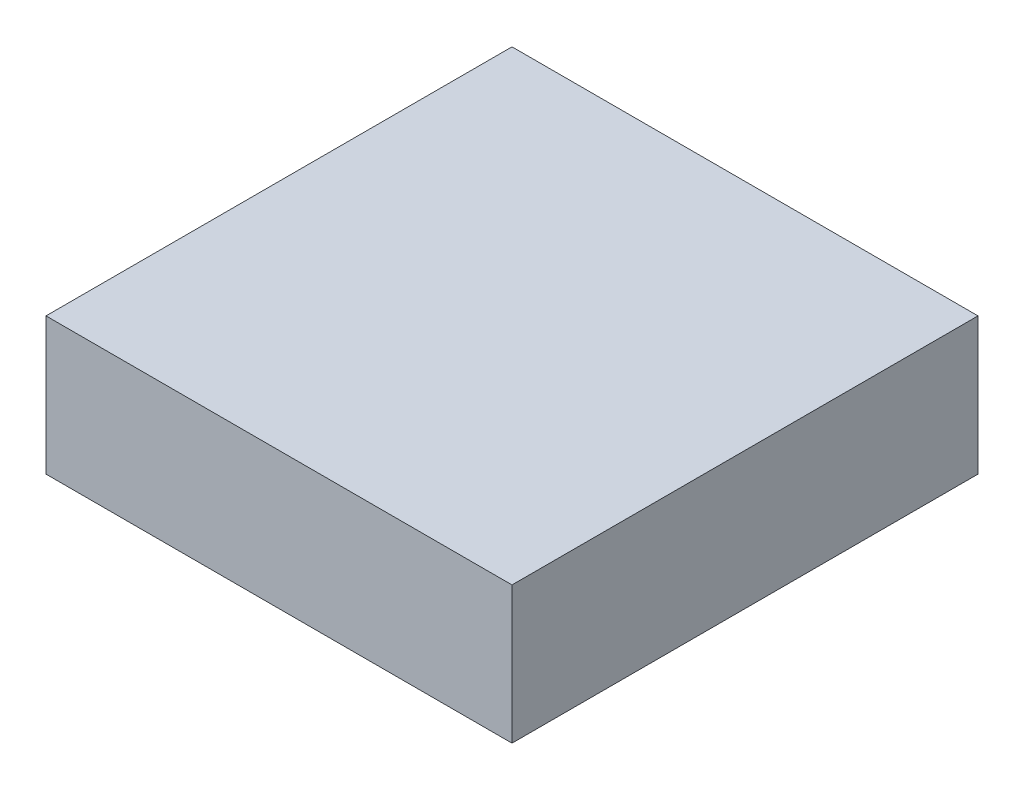
ISO-10303-21;
HEADER;
FILE_DESCRIPTION(('STEP AP214'),'2;1');
FILE_NAME('part.step','',(''),(''),'','','');
FILE_SCHEMA(('AUTOMOTIVE_DESIGN { 1 0 10303 214 1 1 1 1 }'));
ENDSEC;
DATA;
#1=APPLICATION_CONTEXT('core data for automotive mechanical design processes');
#2=APPLICATION_PROTOCOL_DEFINITION('international standard','automotive_design',2000,#1);
#3=PRODUCT_CONTEXT('',#1,'mechanical');
#4=PRODUCT('Part','Part','',(#3));
#5=PRODUCT_RELATED_PRODUCT_CATEGORY('part','',(#4));
#6=PRODUCT_DEFINITION_FORMATION('','',#4);
#7=PRODUCT_DEFINITION_CONTEXT('part definition',#1,'design');
#8=PRODUCT_DEFINITION('design','',#6,#7);
#9=PRODUCT_DEFINITION_SHAPE('','',#8);
#10=(LENGTH_UNIT() NAMED_UNIT(*) SI_UNIT(.MILLI.,.METRE.));
#11=(NAMED_UNIT(*) PLANE_ANGLE_UNIT() SI_UNIT($,.RADIAN.));
#12=(NAMED_UNIT(*) SI_UNIT($,.STERADIAN.) SOLID_ANGLE_UNIT());
#13=UNCERTAINTY_MEASURE_WITH_UNIT(LENGTH_MEASURE(1.E-05),#10,'distance_accuracy_value','');
#14=(GEOMETRIC_REPRESENTATION_CONTEXT(3) GLOBAL_UNCERTAINTY_ASSIGNED_CONTEXT((#13)) GLOBAL_UNIT_ASSIGNED_CONTEXT((#10,
#11,#12)) REPRESENTATION_CONTEXT('',''));
#15=CARTESIAN_POINT('',(0.,0.,0.));
#16=DIRECTION('',(0.,0.,1.));
#17=DIRECTION('',(1.,0.,0.));
#18=AXIS2_PLACEMENT_3D('',#15,#16,#17);
#19=CARTESIAN_POINT('',(0.,127.,0.));
#20=DIRECTION('',(1.,0.,0.));
#21=DIRECTION('',(0.,0.,-1.));
#22=AXIS2_PLACEMENT_3D('',#19,#20,#21);
#23=PLANE('',#22);
#24=DIRECTION('',(0.,0.,1.));
#25=VECTOR('',#24,1.);
#26=CARTESIAN_POINT('',(0.,0.,0.));
#27=LINE('',#26,#25);
#28=CARTESIAN_POINT('',(0.,0.,-431.8));
#29=VERTEX_POINT('',#28);
#30=CARTESIAN_POINT('',(0.,0.,0.));
#31=VERTEX_POINT('',#30);
#32=EDGE_CURVE('E107',#29,#31,#27,.T.);
#33=ORIENTED_EDGE('',*,*,#32,.T.);
#34=DIRECTION('',(0.,-1.,0.));
#35=VECTOR('',#34,1.);
#36=CARTESIAN_POINT('',(0.,127.,0.));
#37=LINE('',#36,#35);
#38=CARTESIAN_POINT('',(0.,127.,0.));
#39=VERTEX_POINT('',#38);
#40=EDGE_CURVE('E11',#39,#31,#37,.T.);
#41=ORIENTED_EDGE('',*,*,#40,.F.);
#42=DIRECTION('',(0.,0.,1.));
#43=VECTOR('',#42,1.);
#44=CARTESIAN_POINT('',(0.,127.,0.));
#45=LINE('',#44,#43);
#46=CARTESIAN_POINT('',(0.,127.,-431.8));
#47=VERTEX_POINT('',#46);
#48=EDGE_CURVE('E91',#47,#39,#45,.T.);
#49=ORIENTED_EDGE('',*,*,#48,.F.);
#50=DIRECTION('',(0.,-1.,0.));
#51=VECTOR('',#50,1.);
#52=CARTESIAN_POINT('',(0.,127.,-431.8));
#53=LINE('',#52,#51);
#54=EDGE_CURVE('E103',#47,#29,#53,.T.);
#55=ORIENTED_EDGE('',*,*,#54,.T.);
#56=EDGE_LOOP('',(#33,#41,#49,#55));
#57=FACE_BOUND('',#56,.T.);
#58=ADVANCED_FACE('F39',(#57),#23,.F.);
#59=CARTESIAN_POINT('',(0.,127.,0.));
#60=DIRECTION('',(0.,0.,-1.));
#61=DIRECTION('',(-1.,0.,0.));
#62=AXIS2_PLACEMENT_3D('',#59,#60,#61);
#63=PLANE('',#62);
#64=DIRECTION('',(1.,0.,0.));
#65=VECTOR('',#64,1.);
#66=CARTESIAN_POINT('',(0.,0.,0.));
#67=LINE('',#66,#65);
#68=CARTESIAN_POINT('',(431.8,0.,0.));
#69=VERTEX_POINT('',#68);
#70=EDGE_CURVE('E96',#31,#69,#67,.T.);
#71=ORIENTED_EDGE('',*,*,#70,.T.);
#72=DIRECTION('',(0.,-1.,0.));
#73=VECTOR('',#72,1.);
#74=CARTESIAN_POINT('',(431.8,127.,0.));
#75=LINE('',#74,#73);
#76=CARTESIAN_POINT('',(431.8,127.,0.));
#77=VERTEX_POINT('',#76);
#78=EDGE_CURVE('E48',#77,#69,#75,.T.);
#79=ORIENTED_EDGE('',*,*,#78,.F.);
#80=DIRECTION('',(1.,0.,0.));
#81=VECTOR('',#80,1.);
#82=CARTESIAN_POINT('',(0.,127.,0.));
#83=LINE('',#82,#81);
#84=EDGE_CURVE('E86',#39,#77,#83,.T.);
#85=ORIENTED_EDGE('',*,*,#84,.F.);
#86=ORIENTED_EDGE('',*,*,#40,.T.);
#87=EDGE_LOOP('',(#71,#79,#85,#86));
#88=FACE_BOUND('',#87,.T.);
#89=ADVANCED_FACE('F95',(#88),#63,.F.);
#90=CARTESIAN_POINT('',(431.8,127.,0.));
#91=DIRECTION('',(-1.,0.,0.));
#92=DIRECTION('',(0.,0.,1.));
#93=AXIS2_PLACEMENT_3D('',#90,#91,#92);
#94=PLANE('',#93);
#95=DIRECTION('',(0.,0.,-1.));
#96=VECTOR('',#95,1.);
#97=CARTESIAN_POINT('',(431.8,0.,0.));
#98=LINE('',#97,#96);
#99=CARTESIAN_POINT('',(431.8,0.,-431.8));
#100=VERTEX_POINT('',#99);
#101=EDGE_CURVE('E73',#69,#100,#98,.T.);
#102=ORIENTED_EDGE('',*,*,#101,.T.);
#103=DIRECTION('',(0.,-1.,0.));
#104=VECTOR('',#103,1.);
#105=CARTESIAN_POINT('',(431.8,127.,-431.8));
#106=LINE('',#105,#104);
#107=CARTESIAN_POINT('',(431.8,127.,-431.8));
#108=VERTEX_POINT('',#107);
#109=EDGE_CURVE('E98',#108,#100,#106,.T.);
#110=ORIENTED_EDGE('',*,*,#109,.F.);
#111=DIRECTION('',(0.,0.,-1.));
#112=VECTOR('',#111,1.);
#113=CARTESIAN_POINT('',(431.8,127.,0.));
#114=LINE('',#113,#112);
#115=EDGE_CURVE('E89',#77,#108,#114,.T.);
#116=ORIENTED_EDGE('',*,*,#115,.F.);
#117=ORIENTED_EDGE('',*,*,#78,.T.);
#118=EDGE_LOOP('',(#102,#110,#116,#117));
#119=FACE_BOUND('',#118,.T.);
#120=ADVANCED_FACE('F99',(#119),#94,.F.);
#121=CARTESIAN_POINT('',(0.,127.,-431.8));
#122=DIRECTION('',(0.,0.,1.));
#123=DIRECTION('',(1.,0.,0.));
#124=AXIS2_PLACEMENT_3D('',#121,#122,#123);
#125=PLANE('',#124);
#126=DIRECTION('',(-1.,0.,0.));
#127=VECTOR('',#126,1.);
#128=CARTESIAN_POINT('',(0.,0.,-431.8));
#129=LINE('',#128,#127);
#130=EDGE_CURVE('E79',#100,#29,#129,.T.);
#131=ORIENTED_EDGE('',*,*,#130,.T.);
#132=ORIENTED_EDGE('',*,*,#54,.F.);
#133=DIRECTION('',(-1.,0.,0.));
#134=VECTOR('',#133,1.);
#135=CARTESIAN_POINT('',(0.,127.,-431.8));
#136=LINE('',#135,#134);
#137=EDGE_CURVE('E56',#108,#47,#136,.T.);
#138=ORIENTED_EDGE('',*,*,#137,.F.);
#139=ORIENTED_EDGE('',*,*,#109,.T.);
#140=EDGE_LOOP('',(#131,#132,#138,#139));
#141=FACE_BOUND('',#140,.T.);
#142=ADVANCED_FACE('F120',(#141),#125,.F.);
#143=CARTESIAN_POINT('',(0.,127.,0.));
#144=DIRECTION('',(0.,-1.,0.));
#145=DIRECTION('',(0.,0.,-1.));
#146=AXIS2_PLACEMENT_3D('',#143,#144,#145);
#147=PLANE('',#146);
#148=ORIENTED_EDGE('',*,*,#48,.T.);
#149=ORIENTED_EDGE('',*,*,#84,.T.);
#150=ORIENTED_EDGE('',*,*,#115,.T.);
#151=ORIENTED_EDGE('',*,*,#137,.T.);
#152=EDGE_LOOP('',(#148,#149,#150,#151));
#153=FACE_BOUND('',#152,.T.);
#154=ADVANCED_FACE('F87',(#153),#147,.F.);
#155=CARTESIAN_POINT('',(0.,0.,0.));
#156=DIRECTION('',(0.,-1.,0.));
#157=DIRECTION('',(0.,0.,-1.));
#158=AXIS2_PLACEMENT_3D('',#155,#156,#157);
#159=PLANE('',#158);
#160=ORIENTED_EDGE('',*,*,#32,.F.);
#161=ORIENTED_EDGE('',*,*,#130,.F.);
#162=ORIENTED_EDGE('',*,*,#101,.F.);
#163=ORIENTED_EDGE('',*,*,#70,.F.);
#164=EDGE_LOOP('',(#160,#161,#162,#163));
#165=FACE_BOUND('',#164,.T.);
#166=ADVANCED_FACE('F123',(#165),#159,.T.);
#167=CLOSED_SHELL('',(#58,#89,#120,#142,#154,#166));
#168=MANIFOLD_SOLID_BREP('B2',#167);
#169=ADVANCED_BREP_SHAPE_REPRESENTATION('',(#18,#168),#14);
#170=SHAPE_DEFINITION_REPRESENTATION(#9,#169);
ENDSEC;
END-ISO-10303-21;
